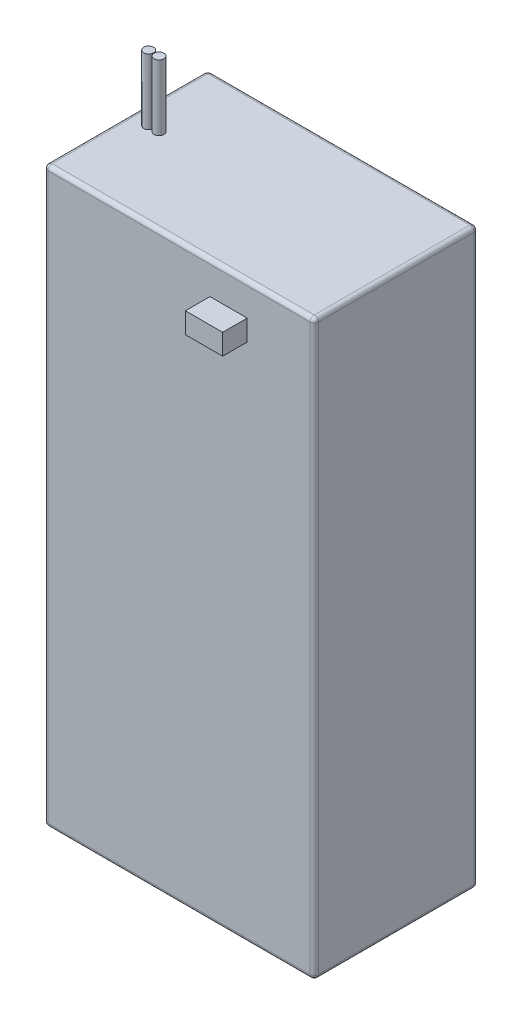
ISO-10303-21;
HEADER;
FILE_DESCRIPTION(('STEP AP214'),'2;1');
FILE_NAME('part.step','',(''),(''),'','','');
FILE_SCHEMA(('AUTOMOTIVE_DESIGN { 1 0 10303 214 1 1 1 1 }'));
ENDSEC;
DATA;
#1=APPLICATION_CONTEXT('core data for automotive mechanical design processes');
#2=APPLICATION_PROTOCOL_DEFINITION('international standard','automotive_design',2000,#1);
#3=PRODUCT_CONTEXT('',#1,'mechanical');
#4=PRODUCT('Part','Part','',(#3));
#5=PRODUCT_RELATED_PRODUCT_CATEGORY('part','',(#4));
#6=PRODUCT_DEFINITION_FORMATION('','',#4);
#7=PRODUCT_DEFINITION_CONTEXT('part definition',#1,'design');
#8=PRODUCT_DEFINITION('design','',#6,#7);
#9=PRODUCT_DEFINITION_SHAPE('','',#8);
#10=(LENGTH_UNIT() NAMED_UNIT(*) SI_UNIT(.MILLI.,.METRE.));
#11=(NAMED_UNIT(*) PLANE_ANGLE_UNIT() SI_UNIT($,.RADIAN.));
#12=(NAMED_UNIT(*) SI_UNIT($,.STERADIAN.) SOLID_ANGLE_UNIT());
#13=UNCERTAINTY_MEASURE_WITH_UNIT(LENGTH_MEASURE(1.E-05),#10,'distance_accuracy_value','');
#14=(GEOMETRIC_REPRESENTATION_CONTEXT(3) GLOBAL_UNCERTAINTY_ASSIGNED_CONTEXT((#13)) GLOBAL_UNIT_ASSIGNED_CONTEXT((#10,
#11,#12)) REPRESENTATION_CONTEXT('',''));
#15=CARTESIAN_POINT('',(0.,0.,0.));
#16=DIRECTION('',(0.,0.,1.));
#17=DIRECTION('',(1.,0.,0.));
#18=AXIS2_PLACEMENT_3D('',#15,#16,#17);
#19=CARTESIAN_POINT('',(0.,0.,20.));
#20=DIRECTION('',(0.,0.,-1.));
#21=DIRECTION('',(-1.,0.,0.));
#22=AXIS2_PLACEMENT_3D('',#19,#20,#21);
#23=PLANE('',#22);
#24=DIRECTION('',(0.,-1.,0.));
#25=VECTOR('',#24,1.);
#26=CARTESIAN_POINT('',(-16.,0.,20.));
#27=LINE('',#26,#25);
#28=CARTESIAN_POINT('',(-16.,34.5,20.));
#29=VERTEX_POINT('',#28);
#30=CARTESIAN_POINT('',(-16.,-34.5,20.));
#31=VERTEX_POINT('',#30);
#32=EDGE_CURVE('E235',#29,#31,#27,.T.);
#33=ORIENTED_EDGE('',*,*,#32,.T.);
#34=DIRECTION('',(1.,0.,0.));
#35=VECTOR('',#34,1.);
#36=CARTESIAN_POINT('',(0.,-34.5,20.));
#37=LINE('',#36,#35);
#38=CARTESIAN_POINT('',(16.,-34.5,20.));
#39=VERTEX_POINT('',#38);
#40=EDGE_CURVE('E240',#31,#39,#37,.T.);
#41=ORIENTED_EDGE('',*,*,#40,.T.);
#42=DIRECTION('',(0.,1.,0.));
#43=VECTOR('',#42,1.);
#44=CARTESIAN_POINT('',(16.,0.,20.));
#45=LINE('',#44,#43);
#46=CARTESIAN_POINT('',(16.,34.5,20.));
#47=VERTEX_POINT('',#46);
#48=EDGE_CURVE('E231',#39,#47,#45,.T.);
#49=ORIENTED_EDGE('',*,*,#48,.T.);
#50=DIRECTION('',(-1.,0.,0.));
#51=VECTOR('',#50,1.);
#52=CARTESIAN_POINT('',(0.,34.5,20.));
#53=LINE('',#52,#51);
#54=EDGE_CURVE('E234',#47,#29,#53,.T.);
#55=ORIENTED_EDGE('',*,*,#54,.T.);
#56=EDGE_LOOP('',(#33,#41,#49,#55));
#57=FACE_BOUND('',#56,.T.);
#58=DIRECTION('',(0.,1.,0.));
#59=VECTOR('',#58,1.);
#60=CARTESIAN_POINT('',(8.31752860162906,31.0762101287074,20.));
#61=LINE('',#60,#59);
#62=CARTESIAN_POINT('',(8.31752860162906,28.5480859336834,20.));
#63=VERTEX_POINT('',#62);
#64=CARTESIAN_POINT('',(8.31752860162906,31.0762101287074,20.));
#65=VERTEX_POINT('',#64);
#66=EDGE_CURVE('E175',#63,#65,#61,.T.);
#67=ORIENTED_EDGE('',*,*,#66,.F.);
#68=DIRECTION('',(1.,0.,0.));
#69=VECTOR('',#68,1.);
#70=CARTESIAN_POINT('',(3.76690505058581,28.5480859336834,20.));
#71=LINE('',#70,#69);
#72=CARTESIAN_POINT('',(3.76690505058581,28.5480859336834,20.));
#73=VERTEX_POINT('',#72);
#74=EDGE_CURVE('E166',#73,#63,#71,.T.);
#75=ORIENTED_EDGE('',*,*,#74,.F.);
#76=DIRECTION('',(0.,-1.,0.));
#77=VECTOR('',#76,1.);
#78=CARTESIAN_POINT('',(3.76690505058581,31.0762101287074,20.));
#79=LINE('',#78,#77);
#80=CARTESIAN_POINT('',(3.76690505058581,31.0762101287074,20.));
#81=VERTEX_POINT('',#80);
#82=EDGE_CURVE('E56',#81,#73,#79,.T.);
#83=ORIENTED_EDGE('',*,*,#82,.F.);
#84=DIRECTION('',(-1.,0.,0.));
#85=VECTOR('',#84,1.);
#86=CARTESIAN_POINT('',(3.76690505058581,31.0762101287074,20.));
#87=LINE('',#86,#85);
#88=EDGE_CURVE('E53',#65,#81,#87,.T.);
#89=ORIENTED_EDGE('',*,*,#88,.F.);
#90=EDGE_LOOP('',(#67,#75,#83,#89));
#91=FACE_BOUND('',#90,.T.);
#92=ADVANCED_FACE('F39',(#57,#91),#23,.F.);
#93=CARTESIAN_POINT('',(16.5,-35.,20.));
#94=DIRECTION('',(-1.,0.,0.));
#95=DIRECTION('',(0.,0.,1.));
#96=AXIS2_PLACEMENT_3D('',#93,#94,#95);
#97=PLANE('',#96);
#98=DIRECTION('',(0.,0.,-1.));
#99=VECTOR('',#98,1.);
#100=CARTESIAN_POINT('',(16.5,-34.5,20.));
#101=LINE('',#100,#99);
#102=CARTESIAN_POINT('',(16.5,-34.5,19.5));
#103=VERTEX_POINT('',#102);
#104=CARTESIAN_POINT('',(16.5,-34.5,0.5));
#105=VERTEX_POINT('',#104);
#106=EDGE_CURVE('E208',#103,#105,#101,.T.);
#107=ORIENTED_EDGE('',*,*,#106,.T.);
#108=DIRECTION('',(0.,1.,0.));
#109=VECTOR('',#108,1.);
#110=CARTESIAN_POINT('',(16.5,35.,0.5));
#111=LINE('',#110,#109);
#112=CARTESIAN_POINT('',(16.5,34.5,0.5));
#113=VERTEX_POINT('',#112);
#114=EDGE_CURVE('E211',#105,#113,#111,.T.);
#115=ORIENTED_EDGE('',*,*,#114,.T.);
#116=DIRECTION('',(0.,0.,-1.));
#117=VECTOR('',#116,1.);
#118=CARTESIAN_POINT('',(16.5,34.5,20.));
#119=LINE('',#118,#117);
#120=CARTESIAN_POINT('',(16.5,34.5,19.5));
#121=VERTEX_POINT('',#120);
#122=EDGE_CURVE('E206',#113,#121,#119,.F.);
#123=ORIENTED_EDGE('',*,*,#122,.T.);
#124=DIRECTION('',(0.,1.,0.));
#125=VECTOR('',#124,1.);
#126=CARTESIAN_POINT('',(16.5,-35.,19.5));
#127=LINE('',#126,#125);
#128=EDGE_CURVE('E204',#121,#103,#127,.F.);
#129=ORIENTED_EDGE('',*,*,#128,.T.);
#130=EDGE_LOOP('',(#107,#115,#123,#129));
#131=FACE_BOUND('',#130,.T.);
#132=ADVANCED_FACE('F314',(#131),#97,.F.);
#133=CARTESIAN_POINT('',(-16.5,35.,20.));
#134=DIRECTION('',(0.,-1.,0.));
#135=DIRECTION('',(0.,0.,-1.));
#136=AXIS2_PLACEMENT_3D('',#133,#134,#135);
#137=PLANE('',#136);
#138=CARTESIAN_POINT('',(-14.1249215842371,35.,9.59177262217281));
#139=DIRECTION('',(0.,-1.,0.));
#140=DIRECTION('',(0.,0.,-1.));
#141=AXIS2_PLACEMENT_3D('',#138,#139,#140);
#142=CIRCLE('',#141,0.6);
#143=CARTESIAN_POINT('',(-14.1249215842371,35.,8.99177262217281));
#144=VERTEX_POINT('',#143);
#145=EDGE_CURVE('E11',#144,#144,#142,.F.);
#146=ORIENTED_EDGE('',*,*,#145,.F.);
#147=EDGE_LOOP('',(#146));
#148=FACE_BOUND('',#147,.T.);
#149=CARTESIAN_POINT('',(-12.8647713158188,35.,9.59177262217281));
#150=DIRECTION('',(0.,-1.,0.));
#151=DIRECTION('',(0.,0.,-1.));
#152=AXIS2_PLACEMENT_3D('',#149,#150,#151);
#153=CIRCLE('',#152,0.6);
#154=CARTESIAN_POINT('',(-12.8647713158188,35.,8.99177262217281));
#155=VERTEX_POINT('',#154);
#156=EDGE_CURVE('E50',#155,#155,#153,.F.);
#157=ORIENTED_EDGE('',*,*,#156,.F.);
#158=EDGE_LOOP('',(#157));
#159=FACE_BOUND('',#158,.T.);
#160=DIRECTION('',(0.,0.,-1.));
#161=VECTOR('',#160,1.);
#162=CARTESIAN_POINT('',(16.,35.,20.));
#163=LINE('',#162,#161);
#164=CARTESIAN_POINT('',(16.,35.,19.5));
#165=VERTEX_POINT('',#164);
#166=CARTESIAN_POINT('',(16.,35.,0.5));
#167=VERTEX_POINT('',#166);
#168=EDGE_CURVE('E220',#165,#167,#163,.T.);
#169=ORIENTED_EDGE('',*,*,#168,.T.);
#170=DIRECTION('',(-1.,0.,0.));
#171=VECTOR('',#170,1.);
#172=CARTESIAN_POINT('',(-16.5,35.,0.5));
#173=LINE('',#172,#171);
#174=CARTESIAN_POINT('',(-16.,35.,0.5));
#175=VERTEX_POINT('',#174);
#176=EDGE_CURVE('E219',#167,#175,#173,.T.);
#177=ORIENTED_EDGE('',*,*,#176,.T.);
#178=DIRECTION('',(0.,0.,-1.));
#179=VECTOR('',#178,1.);
#180=CARTESIAN_POINT('',(-16.,35.,20.));
#181=LINE('',#180,#179);
#182=CARTESIAN_POINT('',(-16.,35.,19.5));
#183=VERTEX_POINT('',#182);
#184=EDGE_CURVE('E214',#175,#183,#181,.F.);
#185=ORIENTED_EDGE('',*,*,#184,.T.);
#186=DIRECTION('',(-1.,0.,0.));
#187=VECTOR('',#186,1.);
#188=CARTESIAN_POINT('',(-16.5,35.,19.5));
#189=LINE('',#188,#187);
#190=EDGE_CURVE('E213',#183,#165,#189,.F.);
#191=ORIENTED_EDGE('',*,*,#190,.T.);
#192=EDGE_LOOP('',(#169,#177,#185,#191));
#193=FACE_BOUND('',#192,.T.);
#194=ADVANCED_FACE('F309',(#148,#159,#193),#137,.F.);
#195=CARTESIAN_POINT('',(-16.5,-35.,20.));
#196=DIRECTION('',(1.,0.,0.));
#197=DIRECTION('',(0.,0.,-1.));
#198=AXIS2_PLACEMENT_3D('',#195,#196,#197);
#199=PLANE('',#198);
#200=DIRECTION('',(0.,0.,-1.));
#201=VECTOR('',#200,1.);
#202=CARTESIAN_POINT('',(-16.5,34.5,20.));
#203=LINE('',#202,#201);
#204=CARTESIAN_POINT('',(-16.5,34.5,19.5));
#205=VERTEX_POINT('',#204);
#206=CARTESIAN_POINT('',(-16.5,34.5,0.5));
#207=VERTEX_POINT('',#206);
#208=EDGE_CURVE('E197',#205,#207,#203,.T.);
#209=ORIENTED_EDGE('',*,*,#208,.T.);
#210=DIRECTION('',(0.,-1.,0.));
#211=VECTOR('',#210,1.);
#212=CARTESIAN_POINT('',(-16.5,-35.,0.5));
#213=LINE('',#212,#211);
#214=CARTESIAN_POINT('',(-16.5,-34.5,0.5));
#215=VERTEX_POINT('',#214);
#216=EDGE_CURVE('E205',#207,#215,#213,.T.);
#217=ORIENTED_EDGE('',*,*,#216,.T.);
#218=DIRECTION('',(0.,0.,-1.));
#219=VECTOR('',#218,1.);
#220=CARTESIAN_POINT('',(-16.5,-34.5,20.));
#221=LINE('',#220,#219);
#222=CARTESIAN_POINT('',(-16.5,-34.5,19.5));
#223=VERTEX_POINT('',#222);
#224=EDGE_CURVE('E200',#215,#223,#221,.F.);
#225=ORIENTED_EDGE('',*,*,#224,.T.);
#226=DIRECTION('',(0.,-1.,0.));
#227=VECTOR('',#226,1.);
#228=CARTESIAN_POINT('',(-16.5,-35.,19.5));
#229=LINE('',#228,#227);
#230=EDGE_CURVE('E195',#223,#205,#229,.F.);
#231=ORIENTED_EDGE('',*,*,#230,.T.);
#232=EDGE_LOOP('',(#209,#217,#225,#231));
#233=FACE_BOUND('',#232,.T.);
#234=ADVANCED_FACE('F311',(#233),#199,.F.);
#235=CARTESIAN_POINT('',(-16.5,-35.,20.));
#236=DIRECTION('',(0.,1.,0.));
#237=DIRECTION('',(0.,0.,1.));
#238=AXIS2_PLACEMENT_3D('',#235,#236,#237);
#239=PLANE('',#238);
#240=DIRECTION('',(0.,0.,-1.));
#241=VECTOR('',#240,1.);
#242=CARTESIAN_POINT('',(-16.,-35.,20.));
#243=LINE('',#242,#241);
#244=CARTESIAN_POINT('',(-16.,-35.,19.5));
#245=VERTEX_POINT('',#244);
#246=CARTESIAN_POINT('',(-16.,-35.,0.5));
#247=VERTEX_POINT('',#246);
#248=EDGE_CURVE('E189',#245,#247,#243,.T.);
#249=ORIENTED_EDGE('',*,*,#248,.T.);
#250=DIRECTION('',(1.,0.,0.));
#251=VECTOR('',#250,1.);
#252=CARTESIAN_POINT('',(16.5,-35.,0.5));
#253=LINE('',#252,#251);
#254=CARTESIAN_POINT('',(16.,-35.,0.5));
#255=VERTEX_POINT('',#254);
#256=EDGE_CURVE('E194',#247,#255,#253,.T.);
#257=ORIENTED_EDGE('',*,*,#256,.T.);
#258=DIRECTION('',(0.,0.,-1.));
#259=VECTOR('',#258,1.);
#260=CARTESIAN_POINT('',(16.,-35.,20.));
#261=LINE('',#260,#259);
#262=CARTESIAN_POINT('',(16.,-35.,19.5));
#263=VERTEX_POINT('',#262);
#264=EDGE_CURVE('E190',#255,#263,#261,.F.);
#265=ORIENTED_EDGE('',*,*,#264,.T.);
#266=DIRECTION('',(1.,0.,0.));
#267=VECTOR('',#266,1.);
#268=CARTESIAN_POINT('',(-16.5,-35.,19.5));
#269=LINE('',#268,#267);
#270=EDGE_CURVE('E183',#263,#245,#269,.F.);
#271=ORIENTED_EDGE('',*,*,#270,.T.);
#272=EDGE_LOOP('',(#249,#257,#265,#271));
#273=FACE_BOUND('',#272,.T.);
#274=ADVANCED_FACE('F419',(#273),#239,.F.);
#275=CARTESIAN_POINT('',(0.,0.,0.));
#276=DIRECTION('',(0.,0.,-1.));
#277=DIRECTION('',(-1.,0.,0.));
#278=AXIS2_PLACEMENT_3D('',#275,#276,#277);
#279=PLANE('',#278);
#280=DIRECTION('',(0.,-1.,0.));
#281=VECTOR('',#280,1.);
#282=CARTESIAN_POINT('',(-16.,35.,0.));
#283=LINE('',#282,#281);
#284=CARTESIAN_POINT('',(-16.,-34.5,0.));
#285=VERTEX_POINT('',#284);
#286=CARTESIAN_POINT('',(-16.,34.5,0.));
#287=VERTEX_POINT('',#286);
#288=EDGE_CURVE('E228',#285,#287,#283,.F.);
#289=ORIENTED_EDGE('',*,*,#288,.T.);
#290=DIRECTION('',(-1.,0.,0.));
#291=VECTOR('',#290,1.);
#292=CARTESIAN_POINT('',(16.5,34.5,0.));
#293=LINE('',#292,#291);
#294=CARTESIAN_POINT('',(16.,34.5,0.));
#295=VERTEX_POINT('',#294);
#296=EDGE_CURVE('E226',#287,#295,#293,.F.);
#297=ORIENTED_EDGE('',*,*,#296,.T.);
#298=DIRECTION('',(0.,1.,0.));
#299=VECTOR('',#298,1.);
#300=CARTESIAN_POINT('',(16.,-35.,0.));
#301=LINE('',#300,#299);
#302=CARTESIAN_POINT('',(16.,-34.5,0.));
#303=VERTEX_POINT('',#302);
#304=EDGE_CURVE('E225',#295,#303,#301,.F.);
#305=ORIENTED_EDGE('',*,*,#304,.T.);
#306=DIRECTION('',(1.,0.,0.));
#307=VECTOR('',#306,1.);
#308=CARTESIAN_POINT('',(-16.5,-34.5,0.));
#309=LINE('',#308,#307);
#310=EDGE_CURVE('E221',#303,#285,#309,.F.);
#311=ORIENTED_EDGE('',*,*,#310,.T.);
#312=EDGE_LOOP('',(#289,#297,#305,#311));
#313=FACE_BOUND('',#312,.T.);
#314=ADVANCED_FACE('F364',(#313),#279,.T.);
#315=CARTESIAN_POINT('',(16.,34.5,20.));
#316=DIRECTION('',(0.,0.,-1.));
#317=DIRECTION('',(-1.,0.,0.));
#318=AXIS2_PLACEMENT_3D('',#315,#316,#317);
#319=CYLINDRICAL_SURFACE('',#318,0.5);
#320=CARTESIAN_POINT('',(16.,34.5,19.5));
#321=DIRECTION('',(0.,0.,1.));
#322=DIRECTION('',(1.,0.,0.));
#323=AXIS2_PLACEMENT_3D('',#320,#321,#322);
#324=CIRCLE('',#323,0.5);
#325=EDGE_CURVE('E186',#121,#165,#324,.T.);
#326=ORIENTED_EDGE('',*,*,#325,.F.);
#327=ORIENTED_EDGE('',*,*,#122,.F.);
#328=CARTESIAN_POINT('',(16.,34.5,0.5));
#329=DIRECTION('',(0.,0.,-1.));
#330=DIRECTION('',(-1.,0.,0.));
#331=AXIS2_PLACEMENT_3D('',#328,#329,#330);
#332=CIRCLE('',#331,0.5);
#333=EDGE_CURVE('E301',#167,#113,#332,.T.);
#334=ORIENTED_EDGE('',*,*,#333,.F.);
#335=ORIENTED_EDGE('',*,*,#168,.F.);
#336=EDGE_LOOP('',(#326,#327,#334,#335));
#337=FACE_BOUND('',#336,.T.);
#338=ADVANCED_FACE('F41',(#337),#319,.T.);
#339=CARTESIAN_POINT('',(16.,34.5,19.5));
#340=DIRECTION('',(0.,1.,0.));
#341=DIRECTION('',(0.,0.,1.));
#342=AXIS2_PLACEMENT_3D('',#339,#340,#341);
#343=SPHERICAL_SURFACE('',#342,0.5);
#344=CARTESIAN_POINT('',(16.,34.5,19.5));
#345=DIRECTION('',(0.,1.,0.));
#346=DIRECTION('',(0.,0.,1.));
#347=AXIS2_PLACEMENT_3D('',#344,#345,#346);
#348=CIRCLE('',#347,0.5);
#349=EDGE_CURVE('E293',#121,#47,#348,.F.);
#350=ORIENTED_EDGE('',*,*,#349,.F.);
#351=ORIENTED_EDGE('',*,*,#325,.T.);
#352=CARTESIAN_POINT('',(16.,34.5,19.5));
#353=DIRECTION('',(1.,0.,0.));
#354=DIRECTION('',(0.,0.,-1.));
#355=AXIS2_PLACEMENT_3D('',#352,#353,#354);
#356=CIRCLE('',#355,0.5);
#357=EDGE_CURVE('E296',#47,#165,#356,.F.);
#358=ORIENTED_EDGE('',*,*,#357,.F.);
#359=EDGE_LOOP('',(#350,#351,#358));
#360=FACE_BOUND('',#359,.T.);
#361=ADVANCED_FACE('F330',(#360),#343,.T.);
#362=CARTESIAN_POINT('',(16.,34.5,0.5));
#363=DIRECTION('',(1.,0.,0.));
#364=DIRECTION('',(0.,0.,-1.));
#365=AXIS2_PLACEMENT_3D('',#362,#363,#364);
#366=SPHERICAL_SURFACE('',#365,0.5);
#367=CARTESIAN_POINT('',(16.,34.5,0.5));
#368=DIRECTION('',(1.,0.,0.));
#369=DIRECTION('',(0.,0.,-1.));
#370=AXIS2_PLACEMENT_3D('',#367,#368,#369);
#371=CIRCLE('',#370,0.5);
#372=EDGE_CURVE('E288',#167,#295,#371,.F.);
#373=ORIENTED_EDGE('',*,*,#372,.F.);
#374=ORIENTED_EDGE('',*,*,#333,.T.);
#375=CARTESIAN_POINT('',(16.,34.5,0.5));
#376=DIRECTION('',(0.,1.,0.));
#377=DIRECTION('',(0.,0.,1.));
#378=AXIS2_PLACEMENT_3D('',#375,#376,#377);
#379=CIRCLE('',#378,0.5);
#380=EDGE_CURVE('E295',#295,#113,#379,.F.);
#381=ORIENTED_EDGE('',*,*,#380,.F.);
#382=EDGE_LOOP('',(#373,#374,#381));
#383=FACE_BOUND('',#382,.T.);
#384=ADVANCED_FACE('F358',(#383),#366,.T.);
#385=CARTESIAN_POINT('',(0.,34.5,19.5));
#386=DIRECTION('',(-1.,0.,0.));
#387=DIRECTION('',(0.,0.,1.));
#388=AXIS2_PLACEMENT_3D('',#385,#386,#387);
#389=CYLINDRICAL_SURFACE('',#388,0.5);
#390=ORIENTED_EDGE('',*,*,#357,.T.);
#391=ORIENTED_EDGE('',*,*,#190,.F.);
#392=CARTESIAN_POINT('',(-16.,34.5,19.5));
#393=DIRECTION('',(-1.,0.,0.));
#394=DIRECTION('',(0.,0.,1.));
#395=AXIS2_PLACEMENT_3D('',#392,#393,#394);
#396=CIRCLE('',#395,0.5);
#397=EDGE_CURVE('E281',#29,#183,#396,.T.);
#398=ORIENTED_EDGE('',*,*,#397,.F.);
#399=ORIENTED_EDGE('',*,*,#54,.F.);
#400=EDGE_LOOP('',(#390,#391,#398,#399));
#401=FACE_BOUND('',#400,.T.);
#402=ADVANCED_FACE('F332',(#401),#389,.T.);
#403=CARTESIAN_POINT('',(16.,0.,19.5));
#404=DIRECTION('',(0.,1.,0.));
#405=DIRECTION('',(0.,0.,1.));
#406=AXIS2_PLACEMENT_3D('',#403,#404,#405);
#407=CYLINDRICAL_SURFACE('',#406,0.5);
#408=ORIENTED_EDGE('',*,*,#349,.T.);
#409=ORIENTED_EDGE('',*,*,#48,.F.);
#410=CARTESIAN_POINT('',(16.,-34.5,19.5));
#411=DIRECTION('',(0.,-1.,0.));
#412=DIRECTION('',(0.,0.,-1.));
#413=AXIS2_PLACEMENT_3D('',#410,#411,#412);
#414=CIRCLE('',#413,0.5);
#415=EDGE_CURVE('E278',#103,#39,#414,.T.);
#416=ORIENTED_EDGE('',*,*,#415,.F.);
#417=ORIENTED_EDGE('',*,*,#128,.F.);
#418=EDGE_LOOP('',(#408,#409,#416,#417));
#419=FACE_BOUND('',#418,.T.);
#420=ADVANCED_FACE('F341',(#419),#407,.T.);
#421=CARTESIAN_POINT('',(16.,-34.5,20.));
#422=DIRECTION('',(0.,0.,-1.));
#423=DIRECTION('',(-1.,0.,0.));
#424=AXIS2_PLACEMENT_3D('',#421,#422,#423);
#425=CYLINDRICAL_SURFACE('',#424,0.5);
#426=CARTESIAN_POINT('',(16.,-34.5,0.5));
#427=DIRECTION('',(0.,0.,-1.));
#428=DIRECTION('',(-1.,0.,0.));
#429=AXIS2_PLACEMENT_3D('',#426,#427,#428);
#430=CIRCLE('',#429,0.5);
#431=EDGE_CURVE('E273',#105,#255,#430,.T.);
#432=ORIENTED_EDGE('',*,*,#431,.F.);
#433=ORIENTED_EDGE('',*,*,#106,.F.);
#434=CARTESIAN_POINT('',(16.,-34.5,19.5));
#435=DIRECTION('',(0.,0.,1.));
#436=DIRECTION('',(1.,0.,0.));
#437=AXIS2_PLACEMENT_3D('',#434,#435,#436);
#438=CIRCLE('',#437,0.5);
#439=EDGE_CURVE('E280',#263,#103,#438,.T.);
#440=ORIENTED_EDGE('',*,*,#439,.F.);
#441=ORIENTED_EDGE('',*,*,#264,.F.);
#442=EDGE_LOOP('',(#432,#433,#440,#441));
#443=FACE_BOUND('',#442,.T.);
#444=ADVANCED_FACE('F350',(#443),#425,.T.);
#445=CARTESIAN_POINT('',(16.,-35.,0.5));
#446=DIRECTION('',(0.,-1.,0.));
#447=DIRECTION('',(0.,0.,-1.));
#448=AXIS2_PLACEMENT_3D('',#445,#446,#447);
#449=CYLINDRICAL_SURFACE('',#448,0.5);
#450=ORIENTED_EDGE('',*,*,#380,.T.);
#451=ORIENTED_EDGE('',*,*,#114,.F.);
#452=CARTESIAN_POINT('',(16.,-34.5,0.5));
#453=DIRECTION('',(0.,-1.,0.));
#454=DIRECTION('',(0.,0.,-1.));
#455=AXIS2_PLACEMENT_3D('',#452,#453,#454);
#456=CIRCLE('',#455,0.5);
#457=EDGE_CURVE('E275',#303,#105,#456,.T.);
#458=ORIENTED_EDGE('',*,*,#457,.F.);
#459=ORIENTED_EDGE('',*,*,#304,.F.);
#460=EDGE_LOOP('',(#450,#451,#458,#459));
#461=FACE_BOUND('',#460,.T.);
#462=ADVANCED_FACE('F354',(#461),#449,.T.);
#463=CARTESIAN_POINT('',(-16.5,34.5,0.5));
#464=DIRECTION('',(1.,0.,0.));
#465=DIRECTION('',(0.,0.,-1.));
#466=AXIS2_PLACEMENT_3D('',#463,#464,#465);
#467=CYLINDRICAL_SURFACE('',#466,0.5);
#468=ORIENTED_EDGE('',*,*,#372,.T.);
#469=ORIENTED_EDGE('',*,*,#296,.F.);
#470=CARTESIAN_POINT('',(-16.,34.5,0.5));
#471=DIRECTION('',(-1.,0.,0.));
#472=DIRECTION('',(0.,0.,1.));
#473=AXIS2_PLACEMENT_3D('',#470,#471,#472);
#474=CIRCLE('',#473,0.5);
#475=EDGE_CURVE('E267',#175,#287,#474,.T.);
#476=ORIENTED_EDGE('',*,*,#475,.F.);
#477=ORIENTED_EDGE('',*,*,#176,.F.);
#478=EDGE_LOOP('',(#468,#469,#476,#477));
#479=FACE_BOUND('',#478,.T.);
#480=ADVANCED_FACE('F362',(#479),#467,.T.);
#481=CARTESIAN_POINT('',(-16.,34.5,20.));
#482=DIRECTION('',(0.,0.,-1.));
#483=DIRECTION('',(-1.,0.,0.));
#484=AXIS2_PLACEMENT_3D('',#481,#482,#483);
#485=CYLINDRICAL_SURFACE('',#484,0.5);
#486=CARTESIAN_POINT('',(-16.,34.5,19.5));
#487=DIRECTION('',(0.,0.,1.));
#488=DIRECTION('',(1.,0.,0.));
#489=AXIS2_PLACEMENT_3D('',#486,#487,#488);
#490=CIRCLE('',#489,0.5);
#491=EDGE_CURVE('E286',#183,#205,#490,.T.);
#492=ORIENTED_EDGE('',*,*,#491,.F.);
#493=ORIENTED_EDGE('',*,*,#184,.F.);
#494=CARTESIAN_POINT('',(-16.,34.5,0.5));
#495=DIRECTION('',(0.,0.,-1.));
#496=DIRECTION('',(-1.,0.,0.));
#497=AXIS2_PLACEMENT_3D('',#494,#495,#496);
#498=CIRCLE('',#497,0.5);
#499=EDGE_CURVE('E266',#207,#175,#498,.T.);
#500=ORIENTED_EDGE('',*,*,#499,.F.);
#501=ORIENTED_EDGE('',*,*,#208,.F.);
#502=EDGE_LOOP('',(#492,#493,#500,#501));
#503=FACE_BOUND('',#502,.T.);
#504=ADVANCED_FACE('F388',(#503),#485,.T.);
#505=CARTESIAN_POINT('',(-16.,34.5,19.5));
#506=DIRECTION('',(0.,1.,0.));
#507=DIRECTION('',(0.,0.,1.));
#508=AXIS2_PLACEMENT_3D('',#505,#506,#507);
#509=SPHERICAL_SURFACE('',#508,0.5);
#510=ORIENTED_EDGE('',*,*,#397,.T.);
#511=ORIENTED_EDGE('',*,*,#491,.T.);
#512=CARTESIAN_POINT('',(-16.,34.5,19.5));
#513=DIRECTION('',(0.,1.,0.));
#514=DIRECTION('',(0.,0.,1.));
#515=AXIS2_PLACEMENT_3D('',#512,#513,#514);
#516=CIRCLE('',#515,0.5);
#517=EDGE_CURVE('E263',#29,#205,#516,.F.);
#518=ORIENTED_EDGE('',*,*,#517,.F.);
#519=EDGE_LOOP('',(#510,#511,#518));
#520=FACE_BOUND('',#519,.T.);
#521=ADVANCED_FACE('F450',(#520),#509,.T.);
#522=CARTESIAN_POINT('',(16.,-34.5,19.5));
#523=DIRECTION('',(1.,0.,0.));
#524=DIRECTION('',(0.,0.,-1.));
#525=AXIS2_PLACEMENT_3D('',#522,#523,#524);
#526=SPHERICAL_SURFACE('',#525,0.5);
#527=ORIENTED_EDGE('',*,*,#439,.T.);
#528=ORIENTED_EDGE('',*,*,#415,.T.);
#529=CARTESIAN_POINT('',(16.,-34.5,19.5));
#530=DIRECTION('',(1.,0.,0.));
#531=DIRECTION('',(0.,0.,-1.));
#532=AXIS2_PLACEMENT_3D('',#529,#530,#531);
#533=CIRCLE('',#532,0.5);
#534=EDGE_CURVE('E261',#263,#39,#533,.F.);
#535=ORIENTED_EDGE('',*,*,#534,.F.);
#536=EDGE_LOOP('',(#527,#528,#535));
#537=FACE_BOUND('',#536,.T.);
#538=ADVANCED_FACE('F404',(#537),#526,.T.);
#539=CARTESIAN_POINT('',(16.,-34.5,0.5));
#540=DIRECTION('',(1.,0.,0.));
#541=DIRECTION('',(0.,0.,-1.));
#542=AXIS2_PLACEMENT_3D('',#539,#540,#541);
#543=SPHERICAL_SURFACE('',#542,0.5);
#544=ORIENTED_EDGE('',*,*,#457,.T.);
#545=ORIENTED_EDGE('',*,*,#431,.T.);
#546=CARTESIAN_POINT('',(16.,-34.5,0.5));
#547=DIRECTION('',(1.,0.,0.));
#548=DIRECTION('',(0.,0.,-1.));
#549=AXIS2_PLACEMENT_3D('',#546,#547,#548);
#550=CIRCLE('',#549,0.5);
#551=EDGE_CURVE('E256',#303,#255,#550,.F.);
#552=ORIENTED_EDGE('',*,*,#551,.F.);
#553=EDGE_LOOP('',(#544,#545,#552));
#554=FACE_BOUND('',#553,.T.);
#555=ADVANCED_FACE('F394',(#554),#543,.T.);
#556=CARTESIAN_POINT('',(-16.,34.5,0.5));
#557=DIRECTION('',(0.,1.,0.));
#558=DIRECTION('',(0.,0.,1.));
#559=AXIS2_PLACEMENT_3D('',#556,#557,#558);
#560=SPHERICAL_SURFACE('',#559,0.5);
#561=ORIENTED_EDGE('',*,*,#499,.T.);
#562=ORIENTED_EDGE('',*,*,#475,.T.);
#563=CARTESIAN_POINT('',(-16.,34.5,0.5));
#564=DIRECTION('',(0.,1.,0.));
#565=DIRECTION('',(0.,0.,1.));
#566=AXIS2_PLACEMENT_3D('',#563,#564,#565);
#567=CIRCLE('',#566,0.5);
#568=EDGE_CURVE('E254',#207,#287,#567,.F.);
#569=ORIENTED_EDGE('',*,*,#568,.F.);
#570=EDGE_LOOP('',(#561,#562,#569));
#571=FACE_BOUND('',#570,.T.);
#572=ADVANCED_FACE('F395',(#571),#560,.T.);
#573=CARTESIAN_POINT('',(-16.,0.,19.5));
#574=DIRECTION('',(0.,-1.,0.));
#575=DIRECTION('',(0.,0.,-1.));
#576=AXIS2_PLACEMENT_3D('',#573,#574,#575);
#577=CYLINDRICAL_SURFACE('',#576,0.5);
#578=ORIENTED_EDGE('',*,*,#517,.T.);
#579=ORIENTED_EDGE('',*,*,#230,.F.);
#580=CARTESIAN_POINT('',(-16.,-34.5,19.5));
#581=DIRECTION('',(0.,-1.,0.));
#582=DIRECTION('',(0.,0.,-1.));
#583=AXIS2_PLACEMENT_3D('',#580,#581,#582);
#584=CIRCLE('',#583,0.5);
#585=EDGE_CURVE('E252',#31,#223,#584,.T.);
#586=ORIENTED_EDGE('',*,*,#585,.F.);
#587=ORIENTED_EDGE('',*,*,#32,.F.);
#588=EDGE_LOOP('',(#578,#579,#586,#587));
#589=FACE_BOUND('',#588,.T.);
#590=ADVANCED_FACE('F392',(#589),#577,.T.);
#591=CARTESIAN_POINT('',(0.,-34.5,19.5));
#592=DIRECTION('',(1.,0.,0.));
#593=DIRECTION('',(0.,0.,-1.));
#594=AXIS2_PLACEMENT_3D('',#591,#592,#593);
#595=CYLINDRICAL_SURFACE('',#594,0.5);
#596=ORIENTED_EDGE('',*,*,#534,.T.);
#597=ORIENTED_EDGE('',*,*,#40,.F.);
#598=CARTESIAN_POINT('',(-16.,-34.5,19.5));
#599=DIRECTION('',(-1.,0.,0.));
#600=DIRECTION('',(0.,0.,1.));
#601=AXIS2_PLACEMENT_3D('',#598,#599,#600);
#602=CIRCLE('',#601,0.5);
#603=EDGE_CURVE('E248',#245,#31,#602,.T.);
#604=ORIENTED_EDGE('',*,*,#603,.F.);
#605=ORIENTED_EDGE('',*,*,#270,.F.);
#606=EDGE_LOOP('',(#596,#597,#604,#605));
#607=FACE_BOUND('',#606,.T.);
#608=ADVANCED_FACE('F402',(#607),#595,.T.);
#609=CARTESIAN_POINT('',(-16.5,-34.5,0.5));
#610=DIRECTION('',(-1.,0.,0.));
#611=DIRECTION('',(0.,0.,1.));
#612=AXIS2_PLACEMENT_3D('',#609,#610,#611);
#613=CYLINDRICAL_SURFACE('',#612,0.5);
#614=ORIENTED_EDGE('',*,*,#551,.T.);
#615=ORIENTED_EDGE('',*,*,#256,.F.);
#616=CARTESIAN_POINT('',(-16.,-34.5,0.5));
#617=DIRECTION('',(-1.,0.,0.));
#618=DIRECTION('',(0.,0.,1.));
#619=AXIS2_PLACEMENT_3D('',#616,#617,#618);
#620=CIRCLE('',#619,0.5);
#621=EDGE_CURVE('E246',#285,#247,#620,.T.);
#622=ORIENTED_EDGE('',*,*,#621,.F.);
#623=ORIENTED_EDGE('',*,*,#310,.F.);
#624=EDGE_LOOP('',(#614,#615,#622,#623));
#625=FACE_BOUND('',#624,.T.);
#626=ADVANCED_FACE('F380',(#625),#613,.T.);
#627=CARTESIAN_POINT('',(-16.,-35.,0.5));
#628=DIRECTION('',(0.,1.,0.));
#629=DIRECTION('',(0.,0.,1.));
#630=AXIS2_PLACEMENT_3D('',#627,#628,#629);
#631=CYLINDRICAL_SURFACE('',#630,0.5);
#632=ORIENTED_EDGE('',*,*,#568,.T.);
#633=ORIENTED_EDGE('',*,*,#288,.F.);
#634=CARTESIAN_POINT('',(-16.,-34.5,0.5));
#635=DIRECTION('',(0.,-1.,0.));
#636=DIRECTION('',(0.,0.,-1.));
#637=AXIS2_PLACEMENT_3D('',#634,#635,#636);
#638=CIRCLE('',#637,0.5);
#639=EDGE_CURVE('E241',#215,#285,#638,.T.);
#640=ORIENTED_EDGE('',*,*,#639,.F.);
#641=ORIENTED_EDGE('',*,*,#216,.F.);
#642=EDGE_LOOP('',(#632,#633,#640,#641));
#643=FACE_BOUND('',#642,.T.);
#644=ADVANCED_FACE('F371',(#643),#631,.T.);
#645=CARTESIAN_POINT('',(-16.,-34.5,19.5));
#646=DIRECTION('',(0.,0.,1.));
#647=DIRECTION('',(1.,0.,0.));
#648=AXIS2_PLACEMENT_3D('',#645,#646,#647);
#649=SPHERICAL_SURFACE('',#648,0.5);
#650=ORIENTED_EDGE('',*,*,#603,.T.);
#651=ORIENTED_EDGE('',*,*,#585,.T.);
#652=CARTESIAN_POINT('',(-16.,-34.5,19.5));
#653=DIRECTION('',(0.,0.,1.));
#654=DIRECTION('',(1.,0.,0.));
#655=AXIS2_PLACEMENT_3D('',#652,#653,#654);
#656=CIRCLE('',#655,0.5);
#657=EDGE_CURVE('E243',#245,#223,#656,.F.);
#658=ORIENTED_EDGE('',*,*,#657,.F.);
#659=EDGE_LOOP('',(#650,#651,#658));
#660=FACE_BOUND('',#659,.T.);
#661=ADVANCED_FACE('F429',(#660),#649,.T.);
#662=CARTESIAN_POINT('',(-16.,-34.5,0.5));
#663=DIRECTION('',(0.,0.,-1.));
#664=DIRECTION('',(-1.,0.,0.));
#665=AXIS2_PLACEMENT_3D('',#662,#663,#664);
#666=SPHERICAL_SURFACE('',#665,0.5);
#667=ORIENTED_EDGE('',*,*,#639,.T.);
#668=ORIENTED_EDGE('',*,*,#621,.T.);
#669=CARTESIAN_POINT('',(-16.,-34.5,0.5));
#670=DIRECTION('',(0.,0.,-1.));
#671=DIRECTION('',(-1.,0.,0.));
#672=AXIS2_PLACEMENT_3D('',#669,#670,#671);
#673=CIRCLE('',#672,0.5);
#674=EDGE_CURVE('E181',#215,#247,#673,.F.);
#675=ORIENTED_EDGE('',*,*,#674,.F.);
#676=EDGE_LOOP('',(#667,#668,#675));
#677=FACE_BOUND('',#676,.T.);
#678=ADVANCED_FACE('F379',(#677),#666,.T.);
#679=CARTESIAN_POINT('',(-16.,-34.5,20.));
#680=DIRECTION('',(0.,0.,-1.));
#681=DIRECTION('',(-1.,0.,0.));
#682=AXIS2_PLACEMENT_3D('',#679,#680,#681);
#683=CYLINDRICAL_SURFACE('',#682,0.5);
#684=ORIENTED_EDGE('',*,*,#657,.T.);
#685=ORIENTED_EDGE('',*,*,#224,.F.);
#686=ORIENTED_EDGE('',*,*,#674,.T.);
#687=ORIENTED_EDGE('',*,*,#248,.F.);
#688=EDGE_LOOP('',(#684,#685,#686,#687));
#689=FACE_BOUND('',#688,.T.);
#690=ADVANCED_FACE('F382',(#689),#683,.T.);
#691=CARTESIAN_POINT('',(-12.8647713158188,43.,9.59177262217281));
#692=DIRECTION('',(0.,-1.,0.));
#693=DIRECTION('',(0.,0.,-1.));
#694=AXIS2_PLACEMENT_3D('',#691,#692,#693);
#695=CYLINDRICAL_SURFACE('',#694,0.6);
#696=CARTESIAN_POINT('',(-12.8647713158188,43.,9.59177262217281));
#697=DIRECTION('',(0.,1.,0.));
#698=DIRECTION('',(0.,0.,1.));
#699=AXIS2_PLACEMENT_3D('',#696,#697,#698);
#700=CIRCLE('',#699,0.6);
#701=CARTESIAN_POINT('',(-12.8647713158188,43.,10.1917726221728));
#702=VERTEX_POINT('',#701);
#703=EDGE_CURVE('E171',#702,#702,#700,.T.);
#704=ORIENTED_EDGE('',*,*,#703,.F.);
#705=EDGE_LOOP('',(#704));
#706=FACE_BOUND('',#705,.T.);
#707=ORIENTED_EDGE('',*,*,#156,.T.);
#708=EDGE_LOOP('',(#707));
#709=FACE_BOUND('',#708,.T.);
#710=ADVANCED_FACE('F306',(#706,#709),#695,.T.);
#711=CARTESIAN_POINT('',(-12.8647713158188,43.,9.59177262217281));
#712=DIRECTION('',(0.,1.,0.));
#713=DIRECTION('',(0.,0.,1.));
#714=AXIS2_PLACEMENT_3D('',#711,#712,#713);
#715=PLANE('',#714);
#716=ORIENTED_EDGE('',*,*,#703,.T.);
#717=EDGE_LOOP('',(#716));
#718=FACE_BOUND('',#717,.T.);
#719=ADVANCED_FACE('F418',(#718),#715,.T.);
#720=CARTESIAN_POINT('',(-14.1249215842371,43.,9.59177262217281));
#721=DIRECTION('',(0.,-1.,0.));
#722=DIRECTION('',(0.,0.,-1.));
#723=AXIS2_PLACEMENT_3D('',#720,#721,#722);
#724=CYLINDRICAL_SURFACE('',#723,0.6);
#725=CARTESIAN_POINT('',(-14.1249215842371,43.,9.59177262217281));
#726=DIRECTION('',(0.,1.,0.));
#727=DIRECTION('',(0.,0.,1.));
#728=AXIS2_PLACEMENT_3D('',#725,#726,#727);
#729=CIRCLE('',#728,0.6);
#730=CARTESIAN_POINT('',(-14.1249215842371,43.,10.1917726221728));
#731=VERTEX_POINT('',#730);
#732=EDGE_CURVE('E176',#731,#731,#729,.T.);
#733=ORIENTED_EDGE('',*,*,#732,.F.);
#734=EDGE_LOOP('',(#733));
#735=FACE_BOUND('',#734,.T.);
#736=ORIENTED_EDGE('',*,*,#145,.T.);
#737=EDGE_LOOP('',(#736));
#738=FACE_BOUND('',#737,.T.);
#739=ADVANCED_FACE('F520',(#735,#738),#724,.T.);
#740=CARTESIAN_POINT('',(-14.1249215842371,43.,9.59177262217281));
#741=DIRECTION('',(0.,1.,0.));
#742=DIRECTION('',(0.,0.,1.));
#743=AXIS2_PLACEMENT_3D('',#740,#741,#742);
#744=PLANE('',#743);
#745=ORIENTED_EDGE('',*,*,#732,.T.);
#746=EDGE_LOOP('',(#745));
#747=FACE_BOUND('',#746,.T.);
#748=ADVANCED_FACE('F523',(#747),#744,.T.);
#749=CARTESIAN_POINT('',(8.31752860162906,31.0762101287074,23.));
#750=DIRECTION('',(-1.,0.,0.));
#751=DIRECTION('',(0.,0.,1.));
#752=AXIS2_PLACEMENT_3D('',#749,#750,#751);
#753=PLANE('',#752);
#754=ORIENTED_EDGE('',*,*,#66,.T.);
#755=DIRECTION('',(0.,0.,-1.));
#756=VECTOR('',#755,1.);
#757=CARTESIAN_POINT('',(8.31752860162906,31.0762101287074,23.));
#758=LINE('',#757,#756);
#759=CARTESIAN_POINT('',(8.31752860162906,31.0762101287074,23.));
#760=VERTEX_POINT('',#759);
#761=EDGE_CURVE('E153',#760,#65,#758,.T.);
#762=ORIENTED_EDGE('',*,*,#761,.F.);
#763=DIRECTION('',(0.,1.,0.));
#764=VECTOR('',#763,1.);
#765=CARTESIAN_POINT('',(8.31752860162906,31.0762101287074,23.));
#766=LINE('',#765,#764);
#767=CARTESIAN_POINT('',(8.31752860162906,28.5480859336834,23.));
#768=VERTEX_POINT('',#767);
#769=EDGE_CURVE('E159',#768,#760,#766,.T.);
#770=ORIENTED_EDGE('',*,*,#769,.F.);
#771=DIRECTION('',(0.,0.,-1.));
#772=VECTOR('',#771,1.);
#773=CARTESIAN_POINT('',(8.31752860162906,28.5480859336834,23.));
#774=LINE('',#773,#772);
#775=EDGE_CURVE('E590',#768,#63,#774,.T.);
#776=ORIENTED_EDGE('',*,*,#775,.T.);
#777=EDGE_LOOP('',(#754,#762,#770,#776));
#778=FACE_BOUND('',#777,.T.);
#779=ADVANCED_FACE('F173',(#778),#753,.F.);
#780=CARTESIAN_POINT('',(3.76690505058581,31.0762101287074,23.));
#781=DIRECTION('',(0.,-1.,0.));
#782=DIRECTION('',(0.,0.,-1.));
#783=AXIS2_PLACEMENT_3D('',#780,#781,#782);
#784=PLANE('',#783);
#785=ORIENTED_EDGE('',*,*,#88,.T.);
#786=DIRECTION('',(0.,0.,-1.));
#787=VECTOR('',#786,1.);
#788=CARTESIAN_POINT('',(3.76690505058581,31.0762101287074,23.));
#789=LINE('',#788,#787);
#790=CARTESIAN_POINT('',(3.76690505058581,31.0762101287074,23.));
#791=VERTEX_POINT('',#790);
#792=EDGE_CURVE('E156',#791,#81,#789,.T.);
#793=ORIENTED_EDGE('',*,*,#792,.F.);
#794=DIRECTION('',(-1.,0.,0.));
#795=VECTOR('',#794,1.);
#796=CARTESIAN_POINT('',(3.76690505058581,31.0762101287074,23.));
#797=LINE('',#796,#795);
#798=EDGE_CURVE('E149',#760,#791,#797,.T.);
#799=ORIENTED_EDGE('',*,*,#798,.F.);
#800=ORIENTED_EDGE('',*,*,#761,.T.);
#801=EDGE_LOOP('',(#785,#793,#799,#800));
#802=FACE_BOUND('',#801,.T.);
#803=ADVANCED_FACE('F151',(#802),#784,.F.);
#804=CARTESIAN_POINT('',(3.76690505058581,31.0762101287074,23.));
#805=DIRECTION('',(1.,0.,0.));
#806=DIRECTION('',(0.,0.,-1.));
#807=AXIS2_PLACEMENT_3D('',#804,#805,#806);
#808=PLANE('',#807);
#809=ORIENTED_EDGE('',*,*,#82,.T.);
#810=DIRECTION('',(0.,0.,-1.));
#811=VECTOR('',#810,1.);
#812=CARTESIAN_POINT('',(3.76690505058581,28.5480859336834,23.));
#813=LINE('',#812,#811);
#814=CARTESIAN_POINT('',(3.76690505058581,28.5480859336834,23.));
#815=VERTEX_POINT('',#814);
#816=EDGE_CURVE('E179',#815,#73,#813,.T.);
#817=ORIENTED_EDGE('',*,*,#816,.F.);
#818=DIRECTION('',(0.,-1.,0.));
#819=VECTOR('',#818,1.);
#820=CARTESIAN_POINT('',(3.76690505058581,31.0762101287074,23.));
#821=LINE('',#820,#819);
#822=EDGE_CURVE('E157',#791,#815,#821,.T.);
#823=ORIENTED_EDGE('',*,*,#822,.F.);
#824=ORIENTED_EDGE('',*,*,#792,.T.);
#825=EDGE_LOOP('',(#809,#817,#823,#824));
#826=FACE_BOUND('',#825,.T.);
#827=ADVANCED_FACE('F553',(#826),#808,.F.);
#828=CARTESIAN_POINT('',(3.76690505058581,28.5480859336834,23.));
#829=DIRECTION('',(0.,1.,0.));
#830=DIRECTION('',(0.,0.,1.));
#831=AXIS2_PLACEMENT_3D('',#828,#829,#830);
#832=PLANE('',#831);
#833=ORIENTED_EDGE('',*,*,#74,.T.);
#834=ORIENTED_EDGE('',*,*,#775,.F.);
#835=DIRECTION('',(1.,0.,0.));
#836=VECTOR('',#835,1.);
#837=CARTESIAN_POINT('',(3.76690505058581,28.5480859336834,23.));
#838=LINE('',#837,#836);
#839=EDGE_CURVE('E164',#815,#768,#838,.T.);
#840=ORIENTED_EDGE('',*,*,#839,.F.);
#841=ORIENTED_EDGE('',*,*,#816,.T.);
#842=EDGE_LOOP('',(#833,#834,#840,#841));
#843=FACE_BOUND('',#842,.T.);
#844=ADVANCED_FACE('F563',(#843),#832,.F.);
#845=CARTESIAN_POINT('',(0.,0.,23.));
#846=DIRECTION('',(0.,0.,1.));
#847=DIRECTION('',(1.,0.,0.));
#848=AXIS2_PLACEMENT_3D('',#845,#846,#847);
#849=PLANE('',#848);
#850=ORIENTED_EDGE('',*,*,#769,.T.);
#851=ORIENTED_EDGE('',*,*,#798,.T.);
#852=ORIENTED_EDGE('',*,*,#822,.T.);
#853=ORIENTED_EDGE('',*,*,#839,.T.);
#854=EDGE_LOOP('',(#850,#851,#852,#853));
#855=FACE_BOUND('',#854,.T.);
#856=ADVANCED_FACE('F162',(#855),#849,.T.);
#857=CLOSED_SHELL('',(#92,#132,#194,#234,#274,#314,#338,#361,#384,#402,#420,#444,#462,#480,#504,
#521,#538,#555,#572,#590,#608,#626,#644,#661,#678,#690,#710,#719,#739,#748,#779,#803,#827,#844,#856));
#858=MANIFOLD_SOLID_BREP('B2',#857);
#859=ADVANCED_BREP_SHAPE_REPRESENTATION('',(#18,#858),#14);
#860=SHAPE_DEFINITION_REPRESENTATION(#9,#859);
ENDSEC;
END-ISO-10303-21;
